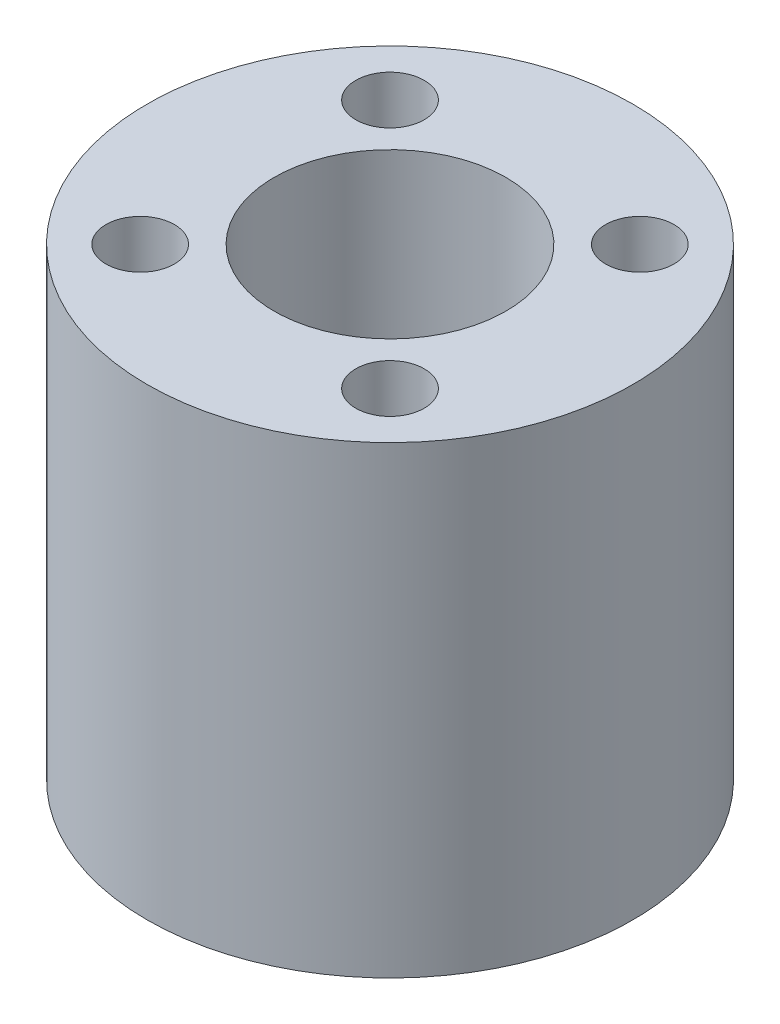
ISO-10303-21;
HEADER;
FILE_DESCRIPTION(('STEP AP214'),'2;1');
FILE_NAME('part.step','',(''),(''),'','','');
FILE_SCHEMA(('AUTOMOTIVE_DESIGN { 1 0 10303 214 1 1 1 1 }'));
ENDSEC;
DATA;
#1=APPLICATION_CONTEXT('core data for automotive mechanical design processes');
#2=APPLICATION_PROTOCOL_DEFINITION('international standard','automotive_design',2000,#1);
#3=PRODUCT_CONTEXT('',#1,'mechanical');
#4=PRODUCT('Part','Part','',(#3));
#5=PRODUCT_RELATED_PRODUCT_CATEGORY('part','',(#4));
#6=PRODUCT_DEFINITION_FORMATION('','',#4);
#7=PRODUCT_DEFINITION_CONTEXT('part definition',#1,'design');
#8=PRODUCT_DEFINITION('design','',#6,#7);
#9=PRODUCT_DEFINITION_SHAPE('','',#8);
#10=(LENGTH_UNIT() NAMED_UNIT(*) SI_UNIT(.MILLI.,.METRE.));
#11=(NAMED_UNIT(*) PLANE_ANGLE_UNIT() SI_UNIT($,.RADIAN.));
#12=(NAMED_UNIT(*) SI_UNIT($,.STERADIAN.) SOLID_ANGLE_UNIT());
#13=UNCERTAINTY_MEASURE_WITH_UNIT(LENGTH_MEASURE(1.E-05),#10,'distance_accuracy_value','');
#14=(GEOMETRIC_REPRESENTATION_CONTEXT(3) GLOBAL_UNCERTAINTY_ASSIGNED_CONTEXT((#13)) GLOBAL_UNIT_ASSIGNED_CONTEXT((#10,
#11,#12)) REPRESENTATION_CONTEXT('',''));
#15=CARTESIAN_POINT('',(0.,0.,0.));
#16=DIRECTION('',(0.,0.,1.));
#17=DIRECTION('',(1.,0.,0.));
#18=AXIS2_PLACEMENT_3D('',#15,#16,#17);
#19=CARTESIAN_POINT('',(1.73194791841524E-11,21.,0.));
#20=DIRECTION('',(0.,1.,0.));
#21=DIRECTION('',(0.,0.,1.));
#22=AXIS2_PLACEMENT_3D('',#19,#20,#21);
#23=PLANE('',#22);
#24=CARTESIAN_POINT('',(-5.65685424949232,21.,5.65685424949238));
#25=DIRECTION('',(0.,1.,0.));
#26=DIRECTION('',(0.,0.,1.));
#27=AXIS2_PLACEMENT_3D('',#24,#25,#26);
#28=CIRCLE('',#27,1.55);
#29=CARTESIAN_POINT('',(-5.65685424949232,21.,4.10685424949238));
#30=VERTEX_POINT('',#29);
#31=EDGE_CURVE('E59',#30,#30,#28,.T.);
#32=ORIENTED_EDGE('',*,*,#31,.F.);
#33=EDGE_LOOP('',(#32));
#34=FACE_BOUND('',#33,.T.);
#35=CARTESIAN_POINT('',(5.65685424949244,21.,-5.65685424949238));
#36=DIRECTION('',(0.,1.,0.));
#37=DIRECTION('',(0.,0.,1.));
#38=AXIS2_PLACEMENT_3D('',#35,#36,#37);
#39=CIRCLE('',#38,1.55);
#40=CARTESIAN_POINT('',(5.65685424949244,21.,-7.20685424949238));
#41=VERTEX_POINT('',#40);
#42=EDGE_CURVE('E47',#41,#41,#39,.T.);
#43=ORIENTED_EDGE('',*,*,#42,.F.);
#44=EDGE_LOOP('',(#43));
#45=FACE_BOUND('',#44,.T.);
#46=CARTESIAN_POINT('',(1.73194791841524E-11,21.,0.));
#47=DIRECTION('',(0.,1.,0.));
#48=DIRECTION('',(0.,0.,1.));
#49=AXIS2_PLACEMENT_3D('',#46,#47,#48);
#50=CIRCLE('',#49,11.);
#51=CARTESIAN_POINT('',(1.73194791841524E-11,21.,-11.));
#52=VERTEX_POINT('',#51);
#53=EDGE_CURVE('E10',#52,#52,#50,.T.);
#54=ORIENTED_EDGE('',*,*,#53,.T.);
#55=EDGE_LOOP('',(#54));
#56=FACE_BOUND('',#55,.T.);
#57=CARTESIAN_POINT('',(1.73194791841524E-11,21.,0.));
#58=DIRECTION('',(0.,1.,0.));
#59=DIRECTION('',(0.,0.,1.));
#60=AXIS2_PLACEMENT_3D('',#57,#58,#59);
#61=CIRCLE('',#60,5.24999999998349);
#62=CARTESIAN_POINT('',(1.73194791841524E-11,21.,-5.24999999998349));
#63=VERTEX_POINT('',#62);
#64=EDGE_CURVE('E42',#63,#63,#61,.T.);
#65=ORIENTED_EDGE('',*,*,#64,.F.);
#66=EDGE_LOOP('',(#65));
#67=FACE_BOUND('',#66,.T.);
#68=CARTESIAN_POINT('',(-5.65685424949232,21.,-5.65685424949238));
#69=DIRECTION('',(0.,1.,0.));
#70=DIRECTION('',(0.,0.,1.));
#71=AXIS2_PLACEMENT_3D('',#68,#69,#70);
#72=CIRCLE('',#71,1.55);
#73=CARTESIAN_POINT('',(-5.65685424949232,21.,-7.20685424949238));
#74=VERTEX_POINT('',#73);
#75=EDGE_CURVE('E53',#74,#74,#72,.T.);
#76=ORIENTED_EDGE('',*,*,#75,.F.);
#77=EDGE_LOOP('',(#76));
#78=FACE_BOUND('',#77,.T.);
#79=CARTESIAN_POINT('',(5.65685424949244,21.,5.65685424949238));
#80=DIRECTION('',(0.,1.,0.));
#81=DIRECTION('',(0.,0.,1.));
#82=AXIS2_PLACEMENT_3D('',#79,#80,#81);
#83=CIRCLE('',#82,1.55);
#84=CARTESIAN_POINT('',(5.65685424949244,21.,4.10685424949238));
#85=VERTEX_POINT('',#84);
#86=EDGE_CURVE('E65',#85,#85,#83,.T.);
#87=ORIENTED_EDGE('',*,*,#86,.F.);
#88=EDGE_LOOP('',(#87));
#89=FACE_BOUND('',#88,.T.);
#90=ADVANCED_FACE('F31',(#34,#45,#56,#67,#78,#89),#23,.T.);
#91=CARTESIAN_POINT('',(1.73194791841524E-11,0.,0.));
#92=DIRECTION('',(0.,1.,0.));
#93=DIRECTION('',(0.,0.,1.));
#94=AXIS2_PLACEMENT_3D('',#91,#92,#93);
#95=PLANE('',#94);
#96=CARTESIAN_POINT('',(1.73194791841524E-11,0.,0.));
#97=DIRECTION('',(0.,1.,0.));
#98=DIRECTION('',(0.,0.,1.));
#99=AXIS2_PLACEMENT_3D('',#96,#97,#98);
#100=CIRCLE('',#99,11.);
#101=CARTESIAN_POINT('',(1.73194791841524E-11,0.,-11.));
#102=VERTEX_POINT('',#101);
#103=EDGE_CURVE('E35',#102,#102,#100,.T.);
#104=ORIENTED_EDGE('',*,*,#103,.F.);
#105=EDGE_LOOP('',(#104));
#106=FACE_BOUND('',#105,.T.);
#107=CARTESIAN_POINT('',(1.73194791841524E-11,0.,0.));
#108=DIRECTION('',(0.,1.,0.));
#109=DIRECTION('',(0.,0.,1.));
#110=AXIS2_PLACEMENT_3D('',#107,#108,#109);
#111=CIRCLE('',#110,5.24999999998349);
#112=CARTESIAN_POINT('',(1.73194791841524E-11,0.,-5.24999999998349));
#113=VERTEX_POINT('',#112);
#114=EDGE_CURVE('E44',#113,#113,#111,.T.);
#115=ORIENTED_EDGE('',*,*,#114,.T.);
#116=EDGE_LOOP('',(#115));
#117=FACE_BOUND('',#116,.T.);
#118=CARTESIAN_POINT('',(5.65685424949244,0.,-5.65685424949238));
#119=DIRECTION('',(0.,1.,0.));
#120=DIRECTION('',(0.,0.,1.));
#121=AXIS2_PLACEMENT_3D('',#118,#119,#120);
#122=CIRCLE('',#121,1.55);
#123=CARTESIAN_POINT('',(5.65685424949244,0.,-7.20685424949238));
#124=VERTEX_POINT('',#123);
#125=EDGE_CURVE('E50',#124,#124,#122,.T.);
#126=ORIENTED_EDGE('',*,*,#125,.T.);
#127=EDGE_LOOP('',(#126));
#128=FACE_BOUND('',#127,.T.);
#129=CARTESIAN_POINT('',(-5.65685424949232,0.,-5.65685424949238));
#130=DIRECTION('',(0.,1.,0.));
#131=DIRECTION('',(0.,0.,1.));
#132=AXIS2_PLACEMENT_3D('',#129,#130,#131);
#133=CIRCLE('',#132,1.55);
#134=CARTESIAN_POINT('',(-5.65685424949232,0.,-7.20685424949238));
#135=VERTEX_POINT('',#134);
#136=EDGE_CURVE('E56',#135,#135,#133,.T.);
#137=ORIENTED_EDGE('',*,*,#136,.T.);
#138=EDGE_LOOP('',(#137));
#139=FACE_BOUND('',#138,.T.);
#140=CARTESIAN_POINT('',(-5.65685424949232,0.,5.65685424949238));
#141=DIRECTION('',(0.,1.,0.));
#142=DIRECTION('',(0.,0.,1.));
#143=AXIS2_PLACEMENT_3D('',#140,#141,#142);
#144=CIRCLE('',#143,1.55);
#145=CARTESIAN_POINT('',(-5.65685424949232,0.,4.10685424949238));
#146=VERTEX_POINT('',#145);
#147=EDGE_CURVE('E62',#146,#146,#144,.T.);
#148=ORIENTED_EDGE('',*,*,#147,.T.);
#149=EDGE_LOOP('',(#148));
#150=FACE_BOUND('',#149,.T.);
#151=CARTESIAN_POINT('',(5.65685424949244,0.,5.65685424949238));
#152=DIRECTION('',(0.,1.,0.));
#153=DIRECTION('',(0.,0.,1.));
#154=AXIS2_PLACEMENT_3D('',#151,#152,#153);
#155=CIRCLE('',#154,1.55);
#156=CARTESIAN_POINT('',(5.65685424949244,0.,4.10685424949238));
#157=VERTEX_POINT('',#156);
#158=EDGE_CURVE('E68',#157,#157,#155,.T.);
#159=ORIENTED_EDGE('',*,*,#158,.T.);
#160=EDGE_LOOP('',(#159));
#161=FACE_BOUND('',#160,.T.);
#162=ADVANCED_FACE('F78',(#106,#117,#128,#139,#150,#161),#95,.F.);
#163=CARTESIAN_POINT('',(1.73194791841524E-11,21.,0.));
#164=DIRECTION('',(0.,-1.,0.));
#165=DIRECTION('',(0.,0.,-1.));
#166=AXIS2_PLACEMENT_3D('',#163,#164,#165);
#167=CYLINDRICAL_SURFACE('',#166,11.);
#168=CARTESIAN_POINT('',(1.73194791841524E-11,21.,-11.));
#169=CARTESIAN_POINT('',(1.73194791841524E-11,20.78125,-11.));
#170=CARTESIAN_POINT('',(1.73194791841524E-11,20.5625,-11.));
#171=CARTESIAN_POINT('',(1.73194791841524E-11,20.125,-11.));
#172=CARTESIAN_POINT('',(1.73194791841524E-11,19.90625,-11.));
#173=CARTESIAN_POINT('',(1.73194791841524E-11,19.46875,-11.));
#174=CARTESIAN_POINT('',(1.73194791841524E-11,19.25,-11.));
#175=CARTESIAN_POINT('',(1.73194791841524E-11,18.8125,-11.));
#176=CARTESIAN_POINT('',(1.73194791841524E-11,18.59375,-11.));
#177=CARTESIAN_POINT('',(1.73194791841524E-11,18.15625,-11.));
#178=CARTESIAN_POINT('',(1.73194791841524E-11,17.9375,-11.));
#179=CARTESIAN_POINT('',(1.73194791841524E-11,17.5,-11.));
#180=CARTESIAN_POINT('',(1.73194791841524E-11,17.28125,-11.));
#181=CARTESIAN_POINT('',(1.73194791841524E-11,16.84375,-11.));
#182=CARTESIAN_POINT('',(1.73194791841524E-11,16.625,-11.));
#183=CARTESIAN_POINT('',(1.73194791841524E-11,16.1875,-11.));
#184=CARTESIAN_POINT('',(1.73194791841524E-11,15.96875,-11.));
#185=CARTESIAN_POINT('',(1.73194791841524E-11,15.53125,-11.));
#186=CARTESIAN_POINT('',(1.73194791841524E-11,15.3125,-11.));
#187=CARTESIAN_POINT('',(1.73194791841524E-11,14.875,-11.));
#188=CARTESIAN_POINT('',(1.73194791841524E-11,14.65625,-11.));
#189=CARTESIAN_POINT('',(1.73194791841524E-11,14.21875,-11.));
#190=CARTESIAN_POINT('',(1.73194791841524E-11,14.,-11.));
#191=CARTESIAN_POINT('',(1.73194791841524E-11,13.5625,-11.));
#192=CARTESIAN_POINT('',(1.73194791841524E-11,13.34375,-11.));
#193=CARTESIAN_POINT('',(1.73194791841524E-11,12.90625,-11.));
#194=CARTESIAN_POINT('',(1.73194791841524E-11,12.6875,-11.));
#195=CARTESIAN_POINT('',(1.73194791841524E-11,12.25,-11.));
#196=CARTESIAN_POINT('',(1.73194791841524E-11,12.03125,-11.));
#197=CARTESIAN_POINT('',(1.73194791841524E-11,11.59375,-11.));
#198=CARTESIAN_POINT('',(1.73194791841524E-11,11.375,-11.));
#199=CARTESIAN_POINT('',(1.73194791841524E-11,10.9375,-11.));
#200=CARTESIAN_POINT('',(1.73194791841524E-11,10.71875,-11.));
#201=CARTESIAN_POINT('',(1.73194791841524E-11,10.28125,-11.));
#202=CARTESIAN_POINT('',(1.73194791841524E-11,10.0625,-11.));
#203=CARTESIAN_POINT('',(1.73194791841524E-11,9.625,-11.));
#204=CARTESIAN_POINT('',(1.73194791841524E-11,9.40625,-11.));
#205=CARTESIAN_POINT('',(1.73194791841524E-11,8.96875,-11.));
#206=CARTESIAN_POINT('',(1.73194791841524E-11,8.75,-11.));
#207=CARTESIAN_POINT('',(1.73194791841524E-11,8.3125,-11.));
#208=CARTESIAN_POINT('',(1.73194791841524E-11,8.09375,-11.));
#209=CARTESIAN_POINT('',(1.73194791841524E-11,7.65625,-11.));
#210=CARTESIAN_POINT('',(1.73194791841524E-11,7.4375,-11.));
#211=CARTESIAN_POINT('',(1.73194791841524E-11,7.,-11.));
#212=CARTESIAN_POINT('',(1.73194791841524E-11,6.78125,-11.));
#213=CARTESIAN_POINT('',(1.73194791841524E-11,6.34375,-11.));
#214=CARTESIAN_POINT('',(1.73194791841524E-11,6.125,-11.));
#215=CARTESIAN_POINT('',(1.73194791841524E-11,5.6875,-11.));
#216=CARTESIAN_POINT('',(1.73194791841524E-11,5.46875,-11.));
#217=CARTESIAN_POINT('',(1.73194791841524E-11,5.03125,-11.));
#218=CARTESIAN_POINT('',(1.73194791841524E-11,4.8125,-11.));
#219=CARTESIAN_POINT('',(1.73194791841524E-11,4.375,-11.));
#220=CARTESIAN_POINT('',(1.73194791841524E-11,4.15625,-11.));
#221=CARTESIAN_POINT('',(1.73194791841524E-11,3.71875,-11.));
#222=CARTESIAN_POINT('',(1.73194791841524E-11,3.5,-11.));
#223=CARTESIAN_POINT('',(1.73194791841524E-11,3.0625,-11.));
#224=CARTESIAN_POINT('',(1.73194791841524E-11,2.84375,-11.));
#225=CARTESIAN_POINT('',(1.73194791841524E-11,2.40625,-11.));
#226=CARTESIAN_POINT('',(1.73194791841524E-11,2.1875,-11.));
#227=CARTESIAN_POINT('',(1.73194791841524E-11,1.75,-11.));
#228=CARTESIAN_POINT('',(1.73194791841524E-11,1.53125,-11.));
#229=CARTESIAN_POINT('',(1.73194791841524E-11,1.09375,-11.));
#230=CARTESIAN_POINT('',(1.73194791841524E-11,0.875000000000001,-11.));
#231=CARTESIAN_POINT('',(1.73194791841524E-11,0.4375,-11.));
#232=CARTESIAN_POINT('',(1.73194791841524E-11,0.21875,-11.));
#233=CARTESIAN_POINT('',(1.73194791841524E-11,0.,-11.));
#234=B_SPLINE_CURVE_WITH_KNOTS('',3,(#168,#169,#170,#171,#172,#173,#174,#175,#176,#177,#178,
#179,#180,#181,#182,#183,#184,#185,#186,#187,#188,#189,#190,#191,#192,#193,#194,#195,#196,#197,
#198,#199,#200,#201,#202,#203,#204,#205,#206,#207,#208,#209,#210,#211,#212,#213,#214,#215,#216,
#217,#218,#219,#220,#221,#222,#223,#224,#225,#226,#227,#228,#229,#230,#231,#232,#233),
.UNSPECIFIED.,.F.,.F.,(4,2,2,2,2,2,2,2,2,2,2,2,2,2,2,2,2,2,2,2,2,2,2,2,2,2,2,2,2,2,2,2,4),(0.,
0.656249999999997,1.3125,1.96875,2.625,3.28125,3.9375,4.59375,5.25,5.90625,6.5625,7.21875,7.875,
8.53125,9.1875,9.84375,10.5,11.15625,11.8125,12.46875,13.125,13.78125,14.4375,15.09375,15.75,
16.40625,17.0625,17.71875,18.375,19.03125,19.6875,20.34375,21.),.UNSPECIFIED.);
#235=EDGE_CURVE('BSEAM33',#52,#102,#234,.T.);
#236=ORIENTED_EDGE('',*,*,#53,.F.);
#237=ORIENTED_EDGE('',*,*,#103,.T.);
#238=ORIENTED_EDGE('',*,*,#235,.T.);
#239=ORIENTED_EDGE('',*,*,#235,.F.);
#240=EDGE_LOOP('',(#236,#238,#237,#239));
#241=FACE_BOUND('',#240,.T.);
#242=ADVANCED_FACE('F33',(#241),#167,.T.);
#243=CARTESIAN_POINT('',(1.73194791841524E-11,21.,0.));
#244=DIRECTION('',(0.,-1.,0.));
#245=DIRECTION('',(0.,0.,-1.));
#246=AXIS2_PLACEMENT_3D('',#243,#244,#245);
#247=CYLINDRICAL_SURFACE('',#246,5.24999999998349);
#248=CARTESIAN_POINT('',(1.73194791841524E-11,21.,-5.24999999998349));
#249=CARTESIAN_POINT('',(1.73194791841524E-11,20.78125,-5.24999999998349));
#250=CARTESIAN_POINT('',(1.73194791841524E-11,20.5625,-5.24999999998349));
#251=CARTESIAN_POINT('',(1.73194791841524E-11,20.125,-5.24999999998349));
#252=CARTESIAN_POINT('',(1.73194791841524E-11,19.90625,-5.24999999998349));
#253=CARTESIAN_POINT('',(1.73194791841524E-11,19.46875,-5.24999999998349));
#254=CARTESIAN_POINT('',(1.73194791841524E-11,19.25,-5.24999999998349));
#255=CARTESIAN_POINT('',(1.73194791841524E-11,18.8125,-5.24999999998349));
#256=CARTESIAN_POINT('',(1.73194791841524E-11,18.59375,-5.24999999998349));
#257=CARTESIAN_POINT('',(1.73194791841524E-11,18.15625,-5.24999999998349));
#258=CARTESIAN_POINT('',(1.73194791841524E-11,17.9375,-5.24999999998349));
#259=CARTESIAN_POINT('',(1.73194791841524E-11,17.5,-5.24999999998349));
#260=CARTESIAN_POINT('',(1.73194791841524E-11,17.28125,-5.24999999998349));
#261=CARTESIAN_POINT('',(1.73194791841524E-11,16.84375,-5.24999999998349));
#262=CARTESIAN_POINT('',(1.73194791841524E-11,16.625,-5.24999999998349));
#263=CARTESIAN_POINT('',(1.73194791841524E-11,16.1875,-5.24999999998349));
#264=CARTESIAN_POINT('',(1.73194791841524E-11,15.96875,-5.24999999998349));
#265=CARTESIAN_POINT('',(1.73194791841524E-11,15.53125,-5.24999999998349));
#266=CARTESIAN_POINT('',(1.73194791841524E-11,15.3125,-5.24999999998349));
#267=CARTESIAN_POINT('',(1.73194791841524E-11,14.875,-5.24999999998349));
#268=CARTESIAN_POINT('',(1.73194791841524E-11,14.65625,-5.24999999998349));
#269=CARTESIAN_POINT('',(1.73194791841524E-11,14.21875,-5.24999999998349));
#270=CARTESIAN_POINT('',(1.73194791841524E-11,14.,-5.24999999998349));
#271=CARTESIAN_POINT('',(1.73194791841524E-11,13.5625,-5.24999999998349));
#272=CARTESIAN_POINT('',(1.73194791841524E-11,13.34375,-5.24999999998349));
#273=CARTESIAN_POINT('',(1.73194791841524E-11,12.90625,-5.24999999998349));
#274=CARTESIAN_POINT('',(1.73194791841524E-11,12.6875,-5.24999999998349));
#275=CARTESIAN_POINT('',(1.73194791841524E-11,12.25,-5.24999999998349));
#276=CARTESIAN_POINT('',(1.73194791841524E-11,12.03125,-5.24999999998349));
#277=CARTESIAN_POINT('',(1.73194791841524E-11,11.59375,-5.24999999998349));
#278=CARTESIAN_POINT('',(1.73194791841524E-11,11.375,-5.24999999998349));
#279=CARTESIAN_POINT('',(1.73194791841524E-11,10.9375,-5.24999999998349));
#280=CARTESIAN_POINT('',(1.73194791841524E-11,10.71875,-5.24999999998349));
#281=CARTESIAN_POINT('',(1.73194791841524E-11,10.28125,-5.24999999998349));
#282=CARTESIAN_POINT('',(1.73194791841524E-11,10.0625,-5.24999999998349));
#283=CARTESIAN_POINT('',(1.73194791841524E-11,9.625,-5.24999999998349));
#284=CARTESIAN_POINT('',(1.73194791841524E-11,9.40625,-5.24999999998349));
#285=CARTESIAN_POINT('',(1.73194791841524E-11,8.96875,-5.24999999998349));
#286=CARTESIAN_POINT('',(1.73194791841524E-11,8.75,-5.24999999998349));
#287=CARTESIAN_POINT('',(1.73194791841524E-11,8.3125,-5.24999999998349));
#288=CARTESIAN_POINT('',(1.73194791841524E-11,8.09375,-5.24999999998349));
#289=CARTESIAN_POINT('',(1.73194791841524E-11,7.65625,-5.24999999998349));
#290=CARTESIAN_POINT('',(1.73194791841524E-11,7.4375,-5.24999999998349));
#291=CARTESIAN_POINT('',(1.73194791841524E-11,7.,-5.24999999998349));
#292=CARTESIAN_POINT('',(1.73194791841524E-11,6.78125,-5.24999999998349));
#293=CARTESIAN_POINT('',(1.73194791841524E-11,6.34375,-5.24999999998349));
#294=CARTESIAN_POINT('',(1.73194791841524E-11,6.125,-5.24999999998349));
#295=CARTESIAN_POINT('',(1.73194791841524E-11,5.6875,-5.24999999998349));
#296=CARTESIAN_POINT('',(1.73194791841524E-11,5.46875,-5.24999999998349));
#297=CARTESIAN_POINT('',(1.73194791841524E-11,5.03125,-5.24999999998349));
#298=CARTESIAN_POINT('',(1.73194791841524E-11,4.8125,-5.24999999998349));
#299=CARTESIAN_POINT('',(1.73194791841524E-11,4.375,-5.24999999998349));
#300=CARTESIAN_POINT('',(1.73194791841524E-11,4.15625,-5.24999999998349));
#301=CARTESIAN_POINT('',(1.73194791841524E-11,3.71875,-5.24999999998349));
#302=CARTESIAN_POINT('',(1.73194791841524E-11,3.5,-5.24999999998349));
#303=CARTESIAN_POINT('',(1.73194791841524E-11,3.0625,-5.24999999998349));
#304=CARTESIAN_POINT('',(1.73194791841524E-11,2.84375,-5.24999999998349));
#305=CARTESIAN_POINT('',(1.73194791841524E-11,2.40625,-5.24999999998349));
#306=CARTESIAN_POINT('',(1.73194791841524E-11,2.1875,-5.24999999998349));
#307=CARTESIAN_POINT('',(1.73194791841524E-11,1.75,-5.24999999998349));
#308=CARTESIAN_POINT('',(1.73194791841524E-11,1.53125,-5.24999999998349));
#309=CARTESIAN_POINT('',(1.73194791841524E-11,1.09375,-5.24999999998349));
#310=CARTESIAN_POINT('',(1.73194791841524E-11,0.875000000000001,-5.24999999998349));
#311=CARTESIAN_POINT('',(1.73194791841524E-11,0.4375,-5.24999999998349));
#312=CARTESIAN_POINT('',(1.73194791841524E-11,0.21875,-5.24999999998349));
#313=CARTESIAN_POINT('',(1.73194791841524E-11,0.,-5.24999999998349));
#314=B_SPLINE_CURVE_WITH_KNOTS('',3,(#248,#249,#250,#251,#252,#253,#254,#255,#256,#257,#258,
#259,#260,#261,#262,#263,#264,#265,#266,#267,#268,#269,#270,#271,#272,#273,#274,#275,#276,#277,
#278,#279,#280,#281,#282,#283,#284,#285,#286,#287,#288,#289,#290,#291,#292,#293,#294,#295,#296,
#297,#298,#299,#300,#301,#302,#303,#304,#305,#306,#307,#308,#309,#310,#311,#312,#313),
.UNSPECIFIED.,.F.,.F.,(4,2,2,2,2,2,2,2,2,2,2,2,2,2,2,2,2,2,2,2,2,2,2,2,2,2,2,2,2,2,2,2,4),(0.,
0.656250000000001,1.3125,1.96875,2.625,3.28125,3.9375,4.59375,5.25,5.90625,6.5625,7.21875,7.875,
8.53125,9.1875,9.84375,10.5,11.15625,11.8125,12.46875,13.125,13.78125,14.4375,15.09375,15.75,
16.40625,17.0625,17.71875,18.375,19.03125,19.6875,20.34375,21.),.UNSPECIFIED.);
#315=EDGE_CURVE('BSEAM88',#63,#113,#314,.T.);
#316=ORIENTED_EDGE('',*,*,#64,.T.);
#317=ORIENTED_EDGE('',*,*,#114,.F.);
#318=ORIENTED_EDGE('',*,*,#315,.T.);
#319=ORIENTED_EDGE('',*,*,#315,.F.);
#320=EDGE_LOOP('',(#316,#318,#317,#319));
#321=FACE_BOUND('',#320,.T.);
#322=ADVANCED_FACE('F88',(#321),#247,.F.);
#323=CARTESIAN_POINT('',(5.65685424949244,21.,-5.65685424949238));
#324=DIRECTION('',(0.,-1.,0.));
#325=DIRECTION('',(0.,0.,-1.));
#326=AXIS2_PLACEMENT_3D('',#323,#324,#325);
#327=CYLINDRICAL_SURFACE('',#326,1.55);
#328=CARTESIAN_POINT('',(5.65685424949244,21.,-7.20685424949238));
#329=CARTESIAN_POINT('',(5.65685424949244,20.78125,-7.20685424949238));
#330=CARTESIAN_POINT('',(5.65685424949244,20.5625,-7.20685424949238));
#331=CARTESIAN_POINT('',(5.65685424949244,20.125,-7.20685424949238));
#332=CARTESIAN_POINT('',(5.65685424949244,19.90625,-7.20685424949238));
#333=CARTESIAN_POINT('',(5.65685424949244,19.46875,-7.20685424949238));
#334=CARTESIAN_POINT('',(5.65685424949244,19.25,-7.20685424949238));
#335=CARTESIAN_POINT('',(5.65685424949244,18.8125,-7.20685424949238));
#336=CARTESIAN_POINT('',(5.65685424949244,18.59375,-7.20685424949238));
#337=CARTESIAN_POINT('',(5.65685424949244,18.15625,-7.20685424949238));
#338=CARTESIAN_POINT('',(5.65685424949244,17.9375,-7.20685424949238));
#339=CARTESIAN_POINT('',(5.65685424949244,17.5,-7.20685424949238));
#340=CARTESIAN_POINT('',(5.65685424949244,17.28125,-7.20685424949238));
#341=CARTESIAN_POINT('',(5.65685424949244,16.84375,-7.20685424949238));
#342=CARTESIAN_POINT('',(5.65685424949244,16.625,-7.20685424949238));
#343=CARTESIAN_POINT('',(5.65685424949244,16.1875,-7.20685424949238));
#344=CARTESIAN_POINT('',(5.65685424949244,15.96875,-7.20685424949238));
#345=CARTESIAN_POINT('',(5.65685424949244,15.53125,-7.20685424949238));
#346=CARTESIAN_POINT('',(5.65685424949244,15.3125,-7.20685424949238));
#347=CARTESIAN_POINT('',(5.65685424949244,14.875,-7.20685424949238));
#348=CARTESIAN_POINT('',(5.65685424949244,14.65625,-7.20685424949238));
#349=CARTESIAN_POINT('',(5.65685424949244,14.21875,-7.20685424949238));
#350=CARTESIAN_POINT('',(5.65685424949244,14.,-7.20685424949238));
#351=CARTESIAN_POINT('',(5.65685424949244,13.5625,-7.20685424949238));
#352=CARTESIAN_POINT('',(5.65685424949244,13.34375,-7.20685424949238));
#353=CARTESIAN_POINT('',(5.65685424949244,12.90625,-7.20685424949238));
#354=CARTESIAN_POINT('',(5.65685424949244,12.6875,-7.20685424949238));
#355=CARTESIAN_POINT('',(5.65685424949244,12.25,-7.20685424949238));
#356=CARTESIAN_POINT('',(5.65685424949244,12.03125,-7.20685424949238));
#357=CARTESIAN_POINT('',(5.65685424949244,11.59375,-7.20685424949238));
#358=CARTESIAN_POINT('',(5.65685424949244,11.375,-7.20685424949238));
#359=CARTESIAN_POINT('',(5.65685424949244,10.9375,-7.20685424949238));
#360=CARTESIAN_POINT('',(5.65685424949244,10.71875,-7.20685424949238));
#361=CARTESIAN_POINT('',(5.65685424949244,10.28125,-7.20685424949238));
#362=CARTESIAN_POINT('',(5.65685424949244,10.0625,-7.20685424949238));
#363=CARTESIAN_POINT('',(5.65685424949244,9.625,-7.20685424949238));
#364=CARTESIAN_POINT('',(5.65685424949244,9.40625,-7.20685424949238));
#365=CARTESIAN_POINT('',(5.65685424949244,8.96875,-7.20685424949238));
#366=CARTESIAN_POINT('',(5.65685424949244,8.75,-7.20685424949238));
#367=CARTESIAN_POINT('',(5.65685424949244,8.3125,-7.20685424949238));
#368=CARTESIAN_POINT('',(5.65685424949244,8.09375,-7.20685424949238));
#369=CARTESIAN_POINT('',(5.65685424949244,7.65625,-7.20685424949238));
#370=CARTESIAN_POINT('',(5.65685424949244,7.4375,-7.20685424949238));
#371=CARTESIAN_POINT('',(5.65685424949244,7.,-7.20685424949238));
#372=CARTESIAN_POINT('',(5.65685424949244,6.78125,-7.20685424949238));
#373=CARTESIAN_POINT('',(5.65685424949244,6.34375,-7.20685424949238));
#374=CARTESIAN_POINT('',(5.65685424949244,6.125,-7.20685424949238));
#375=CARTESIAN_POINT('',(5.65685424949244,5.6875,-7.20685424949238));
#376=CARTESIAN_POINT('',(5.65685424949244,5.46875,-7.20685424949238));
#377=CARTESIAN_POINT('',(5.65685424949244,5.03125,-7.20685424949238));
#378=CARTESIAN_POINT('',(5.65685424949244,4.8125,-7.20685424949238));
#379=CARTESIAN_POINT('',(5.65685424949244,4.375,-7.20685424949238));
#380=CARTESIAN_POINT('',(5.65685424949244,4.15625,-7.20685424949238));
#381=CARTESIAN_POINT('',(5.65685424949244,3.71875,-7.20685424949238));
#382=CARTESIAN_POINT('',(5.65685424949244,3.5,-7.20685424949238));
#383=CARTESIAN_POINT('',(5.65685424949244,3.0625,-7.20685424949238));
#384=CARTESIAN_POINT('',(5.65685424949244,2.84375,-7.20685424949238));
#385=CARTESIAN_POINT('',(5.65685424949244,2.40625,-7.20685424949238));
#386=CARTESIAN_POINT('',(5.65685424949244,2.1875,-7.20685424949238));
#387=CARTESIAN_POINT('',(5.65685424949244,1.75,-7.20685424949238));
#388=CARTESIAN_POINT('',(5.65685424949244,1.53125,-7.20685424949238));
#389=CARTESIAN_POINT('',(5.65685424949244,1.09375,-7.20685424949238));
#390=CARTESIAN_POINT('',(5.65685424949244,0.875000000000001,-7.20685424949238));
#391=CARTESIAN_POINT('',(5.65685424949244,0.4375,-7.20685424949238));
#392=CARTESIAN_POINT('',(5.65685424949244,0.21875,-7.20685424949238));
#393=CARTESIAN_POINT('',(5.65685424949244,0.,-7.20685424949238));
#394=B_SPLINE_CURVE_WITH_KNOTS('',3,(#328,#329,#330,#331,#332,#333,#334,#335,#336,#337,#338,
#339,#340,#341,#342,#343,#344,#345,#346,#347,#348,#349,#350,#351,#352,#353,#354,#355,#356,#357,
#358,#359,#360,#361,#362,#363,#364,#365,#366,#367,#368,#369,#370,#371,#372,#373,#374,#375,#376,
#377,#378,#379,#380,#381,#382,#383,#384,#385,#386,#387,#388,#389,#390,#391,#392,#393),
.UNSPECIFIED.,.F.,.F.,(4,2,2,2,2,2,2,2,2,2,2,2,2,2,2,2,2,2,2,2,2,2,2,2,2,2,2,2,2,2,2,2,4),(0.,
0.656250000000001,1.3125,1.96875,2.625,3.28125,3.9375,4.59375,5.25,5.90625,6.5625,7.21875,7.875,
8.53125,9.1875,9.84375,10.5,11.15625,11.8125,12.46875,13.125,13.78125,14.4375,15.09375,15.75,
16.40625,17.0625,17.71875,18.375,19.03125,19.6875,20.34375,21.),.UNSPECIFIED.);
#395=EDGE_CURVE('BSEAM91',#41,#124,#394,.T.);
#396=ORIENTED_EDGE('',*,*,#42,.T.);
#397=ORIENTED_EDGE('',*,*,#125,.F.);
#398=ORIENTED_EDGE('',*,*,#395,.T.);
#399=ORIENTED_EDGE('',*,*,#395,.F.);
#400=EDGE_LOOP('',(#396,#398,#397,#399));
#401=FACE_BOUND('',#400,.T.);
#402=ADVANCED_FACE('F91',(#401),#327,.F.);
#403=CARTESIAN_POINT('',(-5.65685424949232,21.,-5.65685424949238));
#404=DIRECTION('',(0.,-1.,0.));
#405=DIRECTION('',(0.,0.,-1.));
#406=AXIS2_PLACEMENT_3D('',#403,#404,#405);
#407=CYLINDRICAL_SURFACE('',#406,1.55);
#408=CARTESIAN_POINT('',(-5.65685424949232,21.,-7.20685424949238));
#409=CARTESIAN_POINT('',(-5.65685424949232,20.78125,-7.20685424949238));
#410=CARTESIAN_POINT('',(-5.65685424949232,20.5625,-7.20685424949238));
#411=CARTESIAN_POINT('',(-5.65685424949232,20.125,-7.20685424949238));
#412=CARTESIAN_POINT('',(-5.65685424949232,19.90625,-7.20685424949238));
#413=CARTESIAN_POINT('',(-5.65685424949232,19.46875,-7.20685424949238));
#414=CARTESIAN_POINT('',(-5.65685424949232,19.25,-7.20685424949238));
#415=CARTESIAN_POINT('',(-5.65685424949232,18.8125,-7.20685424949238));
#416=CARTESIAN_POINT('',(-5.65685424949232,18.59375,-7.20685424949238));
#417=CARTESIAN_POINT('',(-5.65685424949232,18.15625,-7.20685424949238));
#418=CARTESIAN_POINT('',(-5.65685424949232,17.9375,-7.20685424949238));
#419=CARTESIAN_POINT('',(-5.65685424949232,17.5,-7.20685424949238));
#420=CARTESIAN_POINT('',(-5.65685424949232,17.28125,-7.20685424949238));
#421=CARTESIAN_POINT('',(-5.65685424949232,16.84375,-7.20685424949238));
#422=CARTESIAN_POINT('',(-5.65685424949232,16.625,-7.20685424949238));
#423=CARTESIAN_POINT('',(-5.65685424949232,16.1875,-7.20685424949238));
#424=CARTESIAN_POINT('',(-5.65685424949232,15.96875,-7.20685424949238));
#425=CARTESIAN_POINT('',(-5.65685424949232,15.53125,-7.20685424949238));
#426=CARTESIAN_POINT('',(-5.65685424949232,15.3125,-7.20685424949238));
#427=CARTESIAN_POINT('',(-5.65685424949232,14.875,-7.20685424949238));
#428=CARTESIAN_POINT('',(-5.65685424949232,14.65625,-7.20685424949238));
#429=CARTESIAN_POINT('',(-5.65685424949232,14.21875,-7.20685424949238));
#430=CARTESIAN_POINT('',(-5.65685424949232,14.,-7.20685424949238));
#431=CARTESIAN_POINT('',(-5.65685424949232,13.5625,-7.20685424949238));
#432=CARTESIAN_POINT('',(-5.65685424949232,13.34375,-7.20685424949238));
#433=CARTESIAN_POINT('',(-5.65685424949232,12.90625,-7.20685424949238));
#434=CARTESIAN_POINT('',(-5.65685424949232,12.6875,-7.20685424949238));
#435=CARTESIAN_POINT('',(-5.65685424949232,12.25,-7.20685424949238));
#436=CARTESIAN_POINT('',(-5.65685424949232,12.03125,-7.20685424949238));
#437=CARTESIAN_POINT('',(-5.65685424949232,11.59375,-7.20685424949238));
#438=CARTESIAN_POINT('',(-5.65685424949232,11.375,-7.20685424949238));
#439=CARTESIAN_POINT('',(-5.65685424949232,10.9375,-7.20685424949238));
#440=CARTESIAN_POINT('',(-5.65685424949232,10.71875,-7.20685424949238));
#441=CARTESIAN_POINT('',(-5.65685424949232,10.28125,-7.20685424949238));
#442=CARTESIAN_POINT('',(-5.65685424949232,10.0625,-7.20685424949238));
#443=CARTESIAN_POINT('',(-5.65685424949232,9.625,-7.20685424949238));
#444=CARTESIAN_POINT('',(-5.65685424949232,9.40625,-7.20685424949238));
#445=CARTESIAN_POINT('',(-5.65685424949232,8.96875,-7.20685424949238));
#446=CARTESIAN_POINT('',(-5.65685424949232,8.75,-7.20685424949238));
#447=CARTESIAN_POINT('',(-5.65685424949232,8.3125,-7.20685424949238));
#448=CARTESIAN_POINT('',(-5.65685424949232,8.09375,-7.20685424949238));
#449=CARTESIAN_POINT('',(-5.65685424949232,7.65625,-7.20685424949238));
#450=CARTESIAN_POINT('',(-5.65685424949232,7.4375,-7.20685424949238));
#451=CARTESIAN_POINT('',(-5.65685424949232,7.,-7.20685424949238));
#452=CARTESIAN_POINT('',(-5.65685424949232,6.78125,-7.20685424949238));
#453=CARTESIAN_POINT('',(-5.65685424949232,6.34375,-7.20685424949238));
#454=CARTESIAN_POINT('',(-5.65685424949232,6.125,-7.20685424949238));
#455=CARTESIAN_POINT('',(-5.65685424949232,5.6875,-7.20685424949238));
#456=CARTESIAN_POINT('',(-5.65685424949232,5.46875,-7.20685424949238));
#457=CARTESIAN_POINT('',(-5.65685424949232,5.03125,-7.20685424949238));
#458=CARTESIAN_POINT('',(-5.65685424949232,4.8125,-7.20685424949238));
#459=CARTESIAN_POINT('',(-5.65685424949232,4.375,-7.20685424949238));
#460=CARTESIAN_POINT('',(-5.65685424949232,4.15625,-7.20685424949238));
#461=CARTESIAN_POINT('',(-5.65685424949232,3.71875,-7.20685424949238));
#462=CARTESIAN_POINT('',(-5.65685424949232,3.5,-7.20685424949238));
#463=CARTESIAN_POINT('',(-5.65685424949232,3.0625,-7.20685424949238));
#464=CARTESIAN_POINT('',(-5.65685424949232,2.84375,-7.20685424949238));
#465=CARTESIAN_POINT('',(-5.65685424949232,2.40625,-7.20685424949238));
#466=CARTESIAN_POINT('',(-5.65685424949232,2.1875,-7.20685424949238));
#467=CARTESIAN_POINT('',(-5.65685424949232,1.75,-7.20685424949238));
#468=CARTESIAN_POINT('',(-5.65685424949232,1.53125,-7.20685424949238));
#469=CARTESIAN_POINT('',(-5.65685424949232,1.09375,-7.20685424949238));
#470=CARTESIAN_POINT('',(-5.65685424949232,0.875000000000001,-7.20685424949238));
#471=CARTESIAN_POINT('',(-5.65685424949232,0.4375,-7.20685424949238));
#472=CARTESIAN_POINT('',(-5.65685424949232,0.21875,-7.20685424949238));
#473=CARTESIAN_POINT('',(-5.65685424949232,0.,-7.20685424949238));
#474=B_SPLINE_CURVE_WITH_KNOTS('',3,(#408,#409,#410,#411,#412,#413,#414,#415,#416,#417,#418,
#419,#420,#421,#422,#423,#424,#425,#426,#427,#428,#429,#430,#431,#432,#433,#434,#435,#436,#437,
#438,#439,#440,#441,#442,#443,#444,#445,#446,#447,#448,#449,#450,#451,#452,#453,#454,#455,#456,
#457,#458,#459,#460,#461,#462,#463,#464,#465,#466,#467,#468,#469,#470,#471,#472,#473),
.UNSPECIFIED.,.F.,.F.,(4,2,2,2,2,2,2,2,2,2,2,2,2,2,2,2,2,2,2,2,2,2,2,2,2,2,2,2,2,2,2,2,4),(0.,
0.656250000000001,1.3125,1.96875,2.625,3.28125,3.9375,4.59375,5.25,5.90625,6.5625,7.21875,7.875,
8.53125,9.1875,9.84375,10.5,11.15625,11.8125,12.46875,13.125,13.78125,14.4375,15.09375,15.75,
16.40625,17.0625,17.71875,18.375,19.03125,19.6875,20.34375,21.),.UNSPECIFIED.);
#475=EDGE_CURVE('BSEAM95',#74,#135,#474,.T.);
#476=ORIENTED_EDGE('',*,*,#75,.T.);
#477=ORIENTED_EDGE('',*,*,#136,.F.);
#478=ORIENTED_EDGE('',*,*,#475,.T.);
#479=ORIENTED_EDGE('',*,*,#475,.F.);
#480=EDGE_LOOP('',(#476,#478,#477,#479));
#481=FACE_BOUND('',#480,.T.);
#482=ADVANCED_FACE('F95',(#481),#407,.F.);
#483=CARTESIAN_POINT('',(-5.65685424949232,21.,5.65685424949238));
#484=DIRECTION('',(0.,-1.,0.));
#485=DIRECTION('',(0.,0.,-1.));
#486=AXIS2_PLACEMENT_3D('',#483,#484,#485);
#487=CYLINDRICAL_SURFACE('',#486,1.55);
#488=CARTESIAN_POINT('',(-5.65685424949232,21.,4.10685424949238));
#489=CARTESIAN_POINT('',(-5.65685424949232,20.78125,4.10685424949238));
#490=CARTESIAN_POINT('',(-5.65685424949232,20.5625,4.10685424949238));
#491=CARTESIAN_POINT('',(-5.65685424949232,20.125,4.10685424949238));
#492=CARTESIAN_POINT('',(-5.65685424949232,19.90625,4.10685424949238));
#493=CARTESIAN_POINT('',(-5.65685424949232,19.46875,4.10685424949238));
#494=CARTESIAN_POINT('',(-5.65685424949232,19.25,4.10685424949238));
#495=CARTESIAN_POINT('',(-5.65685424949232,18.8125,4.10685424949238));
#496=CARTESIAN_POINT('',(-5.65685424949232,18.59375,4.10685424949238));
#497=CARTESIAN_POINT('',(-5.65685424949232,18.15625,4.10685424949238));
#498=CARTESIAN_POINT('',(-5.65685424949232,17.9375,4.10685424949238));
#499=CARTESIAN_POINT('',(-5.65685424949232,17.5,4.10685424949238));
#500=CARTESIAN_POINT('',(-5.65685424949232,17.28125,4.10685424949238));
#501=CARTESIAN_POINT('',(-5.65685424949232,16.84375,4.10685424949238));
#502=CARTESIAN_POINT('',(-5.65685424949232,16.625,4.10685424949238));
#503=CARTESIAN_POINT('',(-5.65685424949232,16.1875,4.10685424949238));
#504=CARTESIAN_POINT('',(-5.65685424949232,15.96875,4.10685424949238));
#505=CARTESIAN_POINT('',(-5.65685424949232,15.53125,4.10685424949238));
#506=CARTESIAN_POINT('',(-5.65685424949232,15.3125,4.10685424949238));
#507=CARTESIAN_POINT('',(-5.65685424949232,14.875,4.10685424949238));
#508=CARTESIAN_POINT('',(-5.65685424949232,14.65625,4.10685424949238));
#509=CARTESIAN_POINT('',(-5.65685424949232,14.21875,4.10685424949238));
#510=CARTESIAN_POINT('',(-5.65685424949232,14.,4.10685424949238));
#511=CARTESIAN_POINT('',(-5.65685424949232,13.5625,4.10685424949238));
#512=CARTESIAN_POINT('',(-5.65685424949232,13.34375,4.10685424949238));
#513=CARTESIAN_POINT('',(-5.65685424949232,12.90625,4.10685424949238));
#514=CARTESIAN_POINT('',(-5.65685424949232,12.6875,4.10685424949238));
#515=CARTESIAN_POINT('',(-5.65685424949232,12.25,4.10685424949238));
#516=CARTESIAN_POINT('',(-5.65685424949232,12.03125,4.10685424949238));
#517=CARTESIAN_POINT('',(-5.65685424949232,11.59375,4.10685424949238));
#518=CARTESIAN_POINT('',(-5.65685424949232,11.375,4.10685424949238));
#519=CARTESIAN_POINT('',(-5.65685424949232,10.9375,4.10685424949238));
#520=CARTESIAN_POINT('',(-5.65685424949232,10.71875,4.10685424949238));
#521=CARTESIAN_POINT('',(-5.65685424949232,10.28125,4.10685424949238));
#522=CARTESIAN_POINT('',(-5.65685424949232,10.0625,4.10685424949238));
#523=CARTESIAN_POINT('',(-5.65685424949232,9.625,4.10685424949238));
#524=CARTESIAN_POINT('',(-5.65685424949232,9.40625,4.10685424949238));
#525=CARTESIAN_POINT('',(-5.65685424949232,8.96875,4.10685424949238));
#526=CARTESIAN_POINT('',(-5.65685424949232,8.75,4.10685424949238));
#527=CARTESIAN_POINT('',(-5.65685424949232,8.3125,4.10685424949238));
#528=CARTESIAN_POINT('',(-5.65685424949232,8.09375,4.10685424949238));
#529=CARTESIAN_POINT('',(-5.65685424949232,7.65625,4.10685424949238));
#530=CARTESIAN_POINT('',(-5.65685424949232,7.4375,4.10685424949238));
#531=CARTESIAN_POINT('',(-5.65685424949232,7.,4.10685424949238));
#532=CARTESIAN_POINT('',(-5.65685424949232,6.78125,4.10685424949238));
#533=CARTESIAN_POINT('',(-5.65685424949232,6.34375,4.10685424949238));
#534=CARTESIAN_POINT('',(-5.65685424949232,6.125,4.10685424949238));
#535=CARTESIAN_POINT('',(-5.65685424949232,5.6875,4.10685424949238));
#536=CARTESIAN_POINT('',(-5.65685424949232,5.46875,4.10685424949238));
#537=CARTESIAN_POINT('',(-5.65685424949232,5.03125,4.10685424949238));
#538=CARTESIAN_POINT('',(-5.65685424949232,4.8125,4.10685424949238));
#539=CARTESIAN_POINT('',(-5.65685424949232,4.375,4.10685424949238));
#540=CARTESIAN_POINT('',(-5.65685424949232,4.15625,4.10685424949238));
#541=CARTESIAN_POINT('',(-5.65685424949232,3.71875,4.10685424949238));
#542=CARTESIAN_POINT('',(-5.65685424949232,3.5,4.10685424949238));
#543=CARTESIAN_POINT('',(-5.65685424949232,3.0625,4.10685424949238));
#544=CARTESIAN_POINT('',(-5.65685424949232,2.84375,4.10685424949238));
#545=CARTESIAN_POINT('',(-5.65685424949232,2.40625,4.10685424949238));
#546=CARTESIAN_POINT('',(-5.65685424949232,2.1875,4.10685424949238));
#547=CARTESIAN_POINT('',(-5.65685424949232,1.75,4.10685424949238));
#548=CARTESIAN_POINT('',(-5.65685424949232,1.53125,4.10685424949238));
#549=CARTESIAN_POINT('',(-5.65685424949232,1.09375,4.10685424949238));
#550=CARTESIAN_POINT('',(-5.65685424949232,0.875000000000001,4.10685424949238));
#551=CARTESIAN_POINT('',(-5.65685424949232,0.4375,4.10685424949238));
#552=CARTESIAN_POINT('',(-5.65685424949232,0.21875,4.10685424949238));
#553=CARTESIAN_POINT('',(-5.65685424949232,0.,4.10685424949238));
#554=B_SPLINE_CURVE_WITH_KNOTS('',3,(#488,#489,#490,#491,#492,#493,#494,#495,#496,#497,#498,
#499,#500,#501,#502,#503,#504,#505,#506,#507,#508,#509,#510,#511,#512,#513,#514,#515,#516,#517,
#518,#519,#520,#521,#522,#523,#524,#525,#526,#527,#528,#529,#530,#531,#532,#533,#534,#535,#536,
#537,#538,#539,#540,#541,#542,#543,#544,#545,#546,#547,#548,#549,#550,#551,#552,#553),
.UNSPECIFIED.,.F.,.F.,(4,2,2,2,2,2,2,2,2,2,2,2,2,2,2,2,2,2,2,2,2,2,2,2,2,2,2,2,2,2,2,2,4),(0.,
0.656250000000001,1.3125,1.96875,2.625,3.28125,3.9375,4.59375,5.25,5.90625,6.5625,7.21875,7.875,
8.53125,9.1875,9.84375,10.5,11.15625,11.8125,12.46875,13.125,13.78125,14.4375,15.09375,15.75,
16.40625,17.0625,17.71875,18.375,19.03125,19.6875,20.34375,21.),.UNSPECIFIED.);
#555=EDGE_CURVE('BSEAM99',#30,#146,#554,.T.);
#556=ORIENTED_EDGE('',*,*,#31,.T.);
#557=ORIENTED_EDGE('',*,*,#147,.F.);
#558=ORIENTED_EDGE('',*,*,#555,.T.);
#559=ORIENTED_EDGE('',*,*,#555,.F.);
#560=EDGE_LOOP('',(#556,#558,#557,#559));
#561=FACE_BOUND('',#560,.T.);
#562=ADVANCED_FACE('F99',(#561),#487,.F.);
#563=CARTESIAN_POINT('',(5.65685424949244,21.,5.65685424949238));
#564=DIRECTION('',(0.,-1.,0.));
#565=DIRECTION('',(0.,0.,-1.));
#566=AXIS2_PLACEMENT_3D('',#563,#564,#565);
#567=CYLINDRICAL_SURFACE('',#566,1.55);
#568=CARTESIAN_POINT('',(5.65685424949244,21.,4.10685424949238));
#569=CARTESIAN_POINT('',(5.65685424949244,20.78125,4.10685424949238));
#570=CARTESIAN_POINT('',(5.65685424949244,20.5625,4.10685424949238));
#571=CARTESIAN_POINT('',(5.65685424949244,20.125,4.10685424949238));
#572=CARTESIAN_POINT('',(5.65685424949244,19.90625,4.10685424949238));
#573=CARTESIAN_POINT('',(5.65685424949244,19.46875,4.10685424949238));
#574=CARTESIAN_POINT('',(5.65685424949244,19.25,4.10685424949238));
#575=CARTESIAN_POINT('',(5.65685424949244,18.8125,4.10685424949238));
#576=CARTESIAN_POINT('',(5.65685424949244,18.59375,4.10685424949238));
#577=CARTESIAN_POINT('',(5.65685424949244,18.15625,4.10685424949238));
#578=CARTESIAN_POINT('',(5.65685424949244,17.9375,4.10685424949238));
#579=CARTESIAN_POINT('',(5.65685424949244,17.5,4.10685424949238));
#580=CARTESIAN_POINT('',(5.65685424949244,17.28125,4.10685424949238));
#581=CARTESIAN_POINT('',(5.65685424949244,16.84375,4.10685424949238));
#582=CARTESIAN_POINT('',(5.65685424949244,16.625,4.10685424949238));
#583=CARTESIAN_POINT('',(5.65685424949244,16.1875,4.10685424949238));
#584=CARTESIAN_POINT('',(5.65685424949244,15.96875,4.10685424949238));
#585=CARTESIAN_POINT('',(5.65685424949244,15.53125,4.10685424949238));
#586=CARTESIAN_POINT('',(5.65685424949244,15.3125,4.10685424949238));
#587=CARTESIAN_POINT('',(5.65685424949244,14.875,4.10685424949238));
#588=CARTESIAN_POINT('',(5.65685424949244,14.65625,4.10685424949238));
#589=CARTESIAN_POINT('',(5.65685424949244,14.21875,4.10685424949238));
#590=CARTESIAN_POINT('',(5.65685424949244,14.,4.10685424949238));
#591=CARTESIAN_POINT('',(5.65685424949244,13.5625,4.10685424949238));
#592=CARTESIAN_POINT('',(5.65685424949244,13.34375,4.10685424949238));
#593=CARTESIAN_POINT('',(5.65685424949244,12.90625,4.10685424949238));
#594=CARTESIAN_POINT('',(5.65685424949244,12.6875,4.10685424949238));
#595=CARTESIAN_POINT('',(5.65685424949244,12.25,4.10685424949238));
#596=CARTESIAN_POINT('',(5.65685424949244,12.03125,4.10685424949238));
#597=CARTESIAN_POINT('',(5.65685424949244,11.59375,4.10685424949238));
#598=CARTESIAN_POINT('',(5.65685424949244,11.375,4.10685424949238));
#599=CARTESIAN_POINT('',(5.65685424949244,10.9375,4.10685424949238));
#600=CARTESIAN_POINT('',(5.65685424949244,10.71875,4.10685424949238));
#601=CARTESIAN_POINT('',(5.65685424949244,10.28125,4.10685424949238));
#602=CARTESIAN_POINT('',(5.65685424949244,10.0625,4.10685424949238));
#603=CARTESIAN_POINT('',(5.65685424949244,9.625,4.10685424949238));
#604=CARTESIAN_POINT('',(5.65685424949244,9.40625,4.10685424949238));
#605=CARTESIAN_POINT('',(5.65685424949244,8.96875,4.10685424949238));
#606=CARTESIAN_POINT('',(5.65685424949244,8.75,4.10685424949238));
#607=CARTESIAN_POINT('',(5.65685424949244,8.3125,4.10685424949238));
#608=CARTESIAN_POINT('',(5.65685424949244,8.09375,4.10685424949238));
#609=CARTESIAN_POINT('',(5.65685424949244,7.65625,4.10685424949238));
#610=CARTESIAN_POINT('',(5.65685424949244,7.4375,4.10685424949238));
#611=CARTESIAN_POINT('',(5.65685424949244,7.,4.10685424949238));
#612=CARTESIAN_POINT('',(5.65685424949244,6.78125,4.10685424949238));
#613=CARTESIAN_POINT('',(5.65685424949244,6.34375,4.10685424949238));
#614=CARTESIAN_POINT('',(5.65685424949244,6.125,4.10685424949238));
#615=CARTESIAN_POINT('',(5.65685424949244,5.6875,4.10685424949238));
#616=CARTESIAN_POINT('',(5.65685424949244,5.46875,4.10685424949238));
#617=CARTESIAN_POINT('',(5.65685424949244,5.03125,4.10685424949238));
#618=CARTESIAN_POINT('',(5.65685424949244,4.8125,4.10685424949238));
#619=CARTESIAN_POINT('',(5.65685424949244,4.375,4.10685424949238));
#620=CARTESIAN_POINT('',(5.65685424949244,4.15625,4.10685424949238));
#621=CARTESIAN_POINT('',(5.65685424949244,3.71875,4.10685424949238));
#622=CARTESIAN_POINT('',(5.65685424949244,3.5,4.10685424949238));
#623=CARTESIAN_POINT('',(5.65685424949244,3.0625,4.10685424949238));
#624=CARTESIAN_POINT('',(5.65685424949244,2.84375,4.10685424949238));
#625=CARTESIAN_POINT('',(5.65685424949244,2.40625,4.10685424949238));
#626=CARTESIAN_POINT('',(5.65685424949244,2.1875,4.10685424949238));
#627=CARTESIAN_POINT('',(5.65685424949244,1.75,4.10685424949238));
#628=CARTESIAN_POINT('',(5.65685424949244,1.53125,4.10685424949238));
#629=CARTESIAN_POINT('',(5.65685424949244,1.09375,4.10685424949238));
#630=CARTESIAN_POINT('',(5.65685424949244,0.875000000000001,4.10685424949238));
#631=CARTESIAN_POINT('',(5.65685424949244,0.4375,4.10685424949238));
#632=CARTESIAN_POINT('',(5.65685424949244,0.21875,4.10685424949238));
#633=CARTESIAN_POINT('',(5.65685424949244,0.,4.10685424949238));
#634=B_SPLINE_CURVE_WITH_KNOTS('',3,(#568,#569,#570,#571,#572,#573,#574,#575,#576,#577,#578,
#579,#580,#581,#582,#583,#584,#585,#586,#587,#588,#589,#590,#591,#592,#593,#594,#595,#596,#597,
#598,#599,#600,#601,#602,#603,#604,#605,#606,#607,#608,#609,#610,#611,#612,#613,#614,#615,#616,
#617,#618,#619,#620,#621,#622,#623,#624,#625,#626,#627,#628,#629,#630,#631,#632,#633),
.UNSPECIFIED.,.F.,.F.,(4,2,2,2,2,2,2,2,2,2,2,2,2,2,2,2,2,2,2,2,2,2,2,2,2,2,2,2,2,2,2,2,4),(0.,
0.656250000000001,1.3125,1.96875,2.625,3.28125,3.9375,4.59375,5.25,5.90625,6.5625,7.21875,7.875,
8.53125,9.1875,9.84375,10.5,11.15625,11.8125,12.46875,13.125,13.78125,14.4375,15.09375,15.75,
16.40625,17.0625,17.71875,18.375,19.03125,19.6875,20.34375,21.),.UNSPECIFIED.);
#635=EDGE_CURVE('BSEAM74',#85,#157,#634,.T.);
#636=ORIENTED_EDGE('',*,*,#86,.T.);
#637=ORIENTED_EDGE('',*,*,#158,.F.);
#638=ORIENTED_EDGE('',*,*,#635,.T.);
#639=ORIENTED_EDGE('',*,*,#635,.F.);
#640=EDGE_LOOP('',(#636,#638,#637,#639));
#641=FACE_BOUND('',#640,.T.);
#642=ADVANCED_FACE('F74',(#641),#567,.F.);
#643=CLOSED_SHELL('',(#90,#162,#242,#322,#402,#482,#562,#642));
#644=MANIFOLD_SOLID_BREP('B2',#643);
#645=ADVANCED_BREP_SHAPE_REPRESENTATION('',(#18,#644),#14);
#646=SHAPE_DEFINITION_REPRESENTATION(#9,#645);
ENDSEC;
END-ISO-10303-21;
